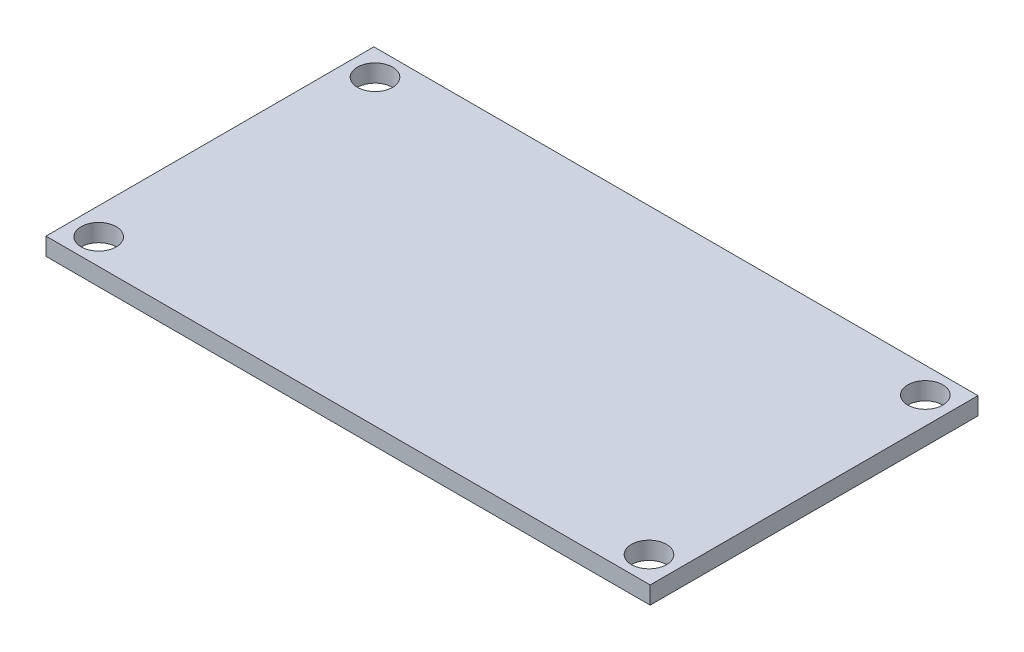
ISO-10303-21;
HEADER;
FILE_DESCRIPTION(('STEP AP214'),'2;1');
FILE_NAME('part.step','',(''),(''),'','','');
FILE_SCHEMA(('AUTOMOTIVE_DESIGN { 1 0 10303 214 1 1 1 1 }'));
ENDSEC;
DATA;
#1=APPLICATION_CONTEXT('core data for automotive mechanical design processes');
#2=APPLICATION_PROTOCOL_DEFINITION('international standard','automotive_design',2000,#1);
#3=PRODUCT_CONTEXT('',#1,'mechanical');
#4=PRODUCT('Part','Part','',(#3));
#5=PRODUCT_RELATED_PRODUCT_CATEGORY('part','',(#4));
#6=PRODUCT_DEFINITION_FORMATION('','',#4);
#7=PRODUCT_DEFINITION_CONTEXT('part definition',#1,'design');
#8=PRODUCT_DEFINITION('design','',#6,#7);
#9=PRODUCT_DEFINITION_SHAPE('','',#8);
#10=(LENGTH_UNIT() NAMED_UNIT(*) SI_UNIT(.MILLI.,.METRE.));
#11=(NAMED_UNIT(*) PLANE_ANGLE_UNIT() SI_UNIT($,.RADIAN.));
#12=(NAMED_UNIT(*) SI_UNIT($,.STERADIAN.) SOLID_ANGLE_UNIT());
#13=UNCERTAINTY_MEASURE_WITH_UNIT(LENGTH_MEASURE(1.E-05),#10,'distance_accuracy_value','');
#14=(GEOMETRIC_REPRESENTATION_CONTEXT(3) GLOBAL_UNCERTAINTY_ASSIGNED_CONTEXT((#13)) GLOBAL_UNIT_ASSIGNED_CONTEXT((#10,
#11,#12)) REPRESENTATION_CONTEXT('',''));
#15=CARTESIAN_POINT('',(0.,0.,0.));
#16=DIRECTION('',(0.,0.,1.));
#17=DIRECTION('',(1.,0.,0.));
#18=AXIS2_PLACEMENT_3D('',#15,#16,#17);
#19=CARTESIAN_POINT('',(0.,1.5,0.));
#20=DIRECTION('',(1.,0.,0.));
#21=DIRECTION('',(0.,0.,-1.));
#22=AXIS2_PLACEMENT_3D('',#19,#20,#21);
#23=PLANE('',#22);
#24=DIRECTION('',(0.,0.,1.));
#25=VECTOR('',#24,1.);
#26=CARTESIAN_POINT('',(0.,0.,0.));
#27=LINE('',#26,#25);
#28=CARTESIAN_POINT('',(0.,0.,0.));
#29=VERTEX_POINT('',#28);
#30=CARTESIAN_POINT('',(0.,0.,28.));
#31=VERTEX_POINT('',#30);
#32=EDGE_CURVE('E96',#29,#31,#27,.T.);
#33=ORIENTED_EDGE('',*,*,#32,.T.);
#34=DIRECTION('',(0.,-1.,0.));
#35=VECTOR('',#34,1.);
#36=CARTESIAN_POINT('',(0.,1.5,28.));
#37=LINE('',#36,#35);
#38=CARTESIAN_POINT('',(0.,1.5,28.));
#39=VERTEX_POINT('',#38);
#40=EDGE_CURVE('E11',#39,#31,#37,.T.);
#41=ORIENTED_EDGE('',*,*,#40,.F.);
#42=DIRECTION('',(0.,0.,1.));
#43=VECTOR('',#42,1.);
#44=CARTESIAN_POINT('',(0.,1.5,0.));
#45=LINE('',#44,#43);
#46=CARTESIAN_POINT('',(0.,1.5,0.));
#47=VERTEX_POINT('',#46);
#48=EDGE_CURVE('E84',#47,#39,#45,.T.);
#49=ORIENTED_EDGE('',*,*,#48,.F.);
#50=DIRECTION('',(0.,-1.,0.));
#51=VECTOR('',#50,1.);
#52=CARTESIAN_POINT('',(0.,1.5,0.));
#53=LINE('',#52,#51);
#54=EDGE_CURVE('E92',#47,#29,#53,.T.);
#55=ORIENTED_EDGE('',*,*,#54,.T.);
#56=EDGE_LOOP('',(#33,#41,#49,#55));
#57=FACE_BOUND('',#56,.T.);
#58=ADVANCED_FACE('F33',(#57),#23,.F.);
#59=CARTESIAN_POINT('',(0.,1.5,28.));
#60=DIRECTION('',(0.,0.,-1.));
#61=DIRECTION('',(-1.,0.,0.));
#62=AXIS2_PLACEMENT_3D('',#59,#60,#61);
#63=PLANE('',#62);
#64=DIRECTION('',(1.,0.,0.));
#65=VECTOR('',#64,1.);
#66=CARTESIAN_POINT('',(0.,0.,28.));
#67=LINE('',#66,#65);
#68=CARTESIAN_POINT('',(51.6,0.,28.));
#69=VERTEX_POINT('',#68);
#70=EDGE_CURVE('E88',#31,#69,#67,.T.);
#71=ORIENTED_EDGE('',*,*,#70,.T.);
#72=DIRECTION('',(0.,-1.,0.));
#73=VECTOR('',#72,1.);
#74=CARTESIAN_POINT('',(51.6,1.5,28.));
#75=LINE('',#74,#73);
#76=CARTESIAN_POINT('',(51.6,1.5,28.));
#77=VERTEX_POINT('',#76);
#78=EDGE_CURVE('E41',#77,#69,#75,.T.);
#79=ORIENTED_EDGE('',*,*,#78,.F.);
#80=DIRECTION('',(1.,0.,0.));
#81=VECTOR('',#80,1.);
#82=CARTESIAN_POINT('',(0.,1.5,28.));
#83=LINE('',#82,#81);
#84=EDGE_CURVE('E79',#39,#77,#83,.T.);
#85=ORIENTED_EDGE('',*,*,#84,.F.);
#86=ORIENTED_EDGE('',*,*,#40,.T.);
#87=EDGE_LOOP('',(#71,#79,#85,#86));
#88=FACE_BOUND('',#87,.T.);
#89=ADVANCED_FACE('F87',(#88),#63,.F.);
#90=CARTESIAN_POINT('',(51.6,1.5,0.));
#91=DIRECTION('',(-1.,0.,0.));
#92=DIRECTION('',(0.,0.,1.));
#93=AXIS2_PLACEMENT_3D('',#90,#91,#92);
#94=PLANE('',#93);
#95=DIRECTION('',(0.,0.,-1.));
#96=VECTOR('',#95,1.);
#97=CARTESIAN_POINT('',(51.6,0.,0.));
#98=LINE('',#97,#96);
#99=CARTESIAN_POINT('',(51.6,0.,0.));
#100=VERTEX_POINT('',#99);
#101=EDGE_CURVE('E66',#69,#100,#98,.T.);
#102=ORIENTED_EDGE('',*,*,#101,.T.);
#103=DIRECTION('',(0.,-1.,0.));
#104=VECTOR('',#103,1.);
#105=CARTESIAN_POINT('',(51.6,1.5,0.));
#106=LINE('',#105,#104);
#107=CARTESIAN_POINT('',(51.6,1.5,0.));
#108=VERTEX_POINT('',#107);
#109=EDGE_CURVE('E89',#108,#100,#106,.T.);
#110=ORIENTED_EDGE('',*,*,#109,.F.);
#111=DIRECTION('',(0.,0.,-1.));
#112=VECTOR('',#111,1.);
#113=CARTESIAN_POINT('',(51.6,1.5,0.));
#114=LINE('',#113,#112);
#115=EDGE_CURVE('E82',#77,#108,#114,.T.);
#116=ORIENTED_EDGE('',*,*,#115,.F.);
#117=ORIENTED_EDGE('',*,*,#78,.T.);
#118=EDGE_LOOP('',(#102,#110,#116,#117));
#119=FACE_BOUND('',#118,.T.);
#120=ADVANCED_FACE('F90',(#119),#94,.F.);
#121=CARTESIAN_POINT('',(0.,1.5,0.));
#122=DIRECTION('',(0.,0.,1.));
#123=DIRECTION('',(1.,0.,0.));
#124=AXIS2_PLACEMENT_3D('',#121,#122,#123);
#125=PLANE('',#124);
#126=DIRECTION('',(-1.,0.,0.));
#127=VECTOR('',#126,1.);
#128=CARTESIAN_POINT('',(0.,0.,0.));
#129=LINE('',#128,#127);
#130=EDGE_CURVE('E72',#100,#29,#129,.T.);
#131=ORIENTED_EDGE('',*,*,#130,.T.);
#132=ORIENTED_EDGE('',*,*,#54,.F.);
#133=DIRECTION('',(-1.,0.,0.));
#134=VECTOR('',#133,1.);
#135=CARTESIAN_POINT('',(0.,1.5,0.));
#136=LINE('',#135,#134);
#137=EDGE_CURVE('E49',#108,#47,#136,.T.);
#138=ORIENTED_EDGE('',*,*,#137,.F.);
#139=ORIENTED_EDGE('',*,*,#109,.T.);
#140=EDGE_LOOP('',(#131,#132,#138,#139));
#141=FACE_BOUND('',#140,.T.);
#142=ADVANCED_FACE('F104',(#141),#125,.F.);
#143=CARTESIAN_POINT('',(0.,1.5,0.));
#144=DIRECTION('',(0.,1.,0.));
#145=DIRECTION('',(0.,0.,1.));
#146=AXIS2_PLACEMENT_3D('',#143,#144,#145);
#147=PLANE('',#146);
#148=CARTESIAN_POINT('',(2.30000000000025,1.5,25.8));
#149=DIRECTION('',(0.,1.,0.));
#150=DIRECTION('',(0.,0.,1.));
#151=AXIS2_PLACEMENT_3D('',#148,#149,#150);
#152=CIRCLE('',#151,1.5);
#153=CARTESIAN_POINT('',(2.30000000000025,1.5,27.3));
#154=VERTEX_POINT('',#153);
#155=EDGE_CURVE('E116',#154,#154,#152,.T.);
#156=ORIENTED_EDGE('',*,*,#155,.F.);
#157=EDGE_LOOP('',(#156));
#158=FACE_BOUND('',#157,.T.);
#159=CARTESIAN_POINT('',(49.3000000000002,1.5,25.8));
#160=DIRECTION('',(0.,1.,0.));
#161=DIRECTION('',(0.,0.,1.));
#162=AXIS2_PLACEMENT_3D('',#159,#160,#161);
#163=CIRCLE('',#162,1.5);
#164=CARTESIAN_POINT('',(49.3000000000002,1.5,27.3));
#165=VERTEX_POINT('',#164);
#166=EDGE_CURVE('E122',#165,#165,#163,.T.);
#167=ORIENTED_EDGE('',*,*,#166,.F.);
#168=EDGE_LOOP('',(#167));
#169=FACE_BOUND('',#168,.T.);
#170=CARTESIAN_POINT('',(49.3,1.5,2.2));
#171=DIRECTION('',(0.,1.,0.));
#172=DIRECTION('',(0.,0.,1.));
#173=AXIS2_PLACEMENT_3D('',#170,#171,#172);
#174=CIRCLE('',#173,1.5);
#175=CARTESIAN_POINT('',(49.3,1.5,3.7));
#176=VERTEX_POINT('',#175);
#177=EDGE_CURVE('E128',#176,#176,#174,.T.);
#178=ORIENTED_EDGE('',*,*,#177,.F.);
#179=EDGE_LOOP('',(#178));
#180=FACE_BOUND('',#179,.T.);
#181=CARTESIAN_POINT('',(2.3,1.5,2.2));
#182=DIRECTION('',(0.,1.,0.));
#183=DIRECTION('',(0.,0.,1.));
#184=AXIS2_PLACEMENT_3D('',#181,#182,#183);
#185=CIRCLE('',#184,1.5);
#186=CARTESIAN_POINT('',(2.3,1.5,3.7));
#187=VERTEX_POINT('',#186);
#188=EDGE_CURVE('E110',#187,#187,#185,.T.);
#189=ORIENTED_EDGE('',*,*,#188,.F.);
#190=EDGE_LOOP('',(#189));
#191=FACE_BOUND('',#190,.T.);
#192=ORIENTED_EDGE('',*,*,#48,.T.);
#193=ORIENTED_EDGE('',*,*,#84,.T.);
#194=ORIENTED_EDGE('',*,*,#115,.T.);
#195=ORIENTED_EDGE('',*,*,#137,.T.);
#196=EDGE_LOOP('',(#192,#193,#194,#195));
#197=FACE_BOUND('',#196,.T.);
#198=ADVANCED_FACE('F80',(#158,#169,#180,#191,#197),#147,.T.);
#199=CARTESIAN_POINT('',(0.,0.,0.));
#200=DIRECTION('',(0.,1.,0.));
#201=DIRECTION('',(0.,0.,1.));
#202=AXIS2_PLACEMENT_3D('',#199,#200,#201);
#203=PLANE('',#202);
#204=CARTESIAN_POINT('',(2.30000000000025,0.,25.8));
#205=DIRECTION('',(0.,1.,0.));
#206=DIRECTION('',(0.,0.,1.));
#207=AXIS2_PLACEMENT_3D('',#204,#205,#206);
#208=CIRCLE('',#207,1.5);
#209=CARTESIAN_POINT('',(2.30000000000025,0.,27.3));
#210=VERTEX_POINT('',#209);
#211=EDGE_CURVE('E119',#210,#210,#208,.T.);
#212=ORIENTED_EDGE('',*,*,#211,.T.);
#213=EDGE_LOOP('',(#212));
#214=FACE_BOUND('',#213,.T.);
#215=CARTESIAN_POINT('',(49.3000000000002,0.,25.8));
#216=DIRECTION('',(0.,1.,0.));
#217=DIRECTION('',(0.,0.,1.));
#218=AXIS2_PLACEMENT_3D('',#215,#216,#217);
#219=CIRCLE('',#218,1.5);
#220=CARTESIAN_POINT('',(49.3000000000002,0.,27.3));
#221=VERTEX_POINT('',#220);
#222=EDGE_CURVE('E125',#221,#221,#219,.T.);
#223=ORIENTED_EDGE('',*,*,#222,.T.);
#224=EDGE_LOOP('',(#223));
#225=FACE_BOUND('',#224,.T.);
#226=CARTESIAN_POINT('',(49.3,0.,2.2));
#227=DIRECTION('',(0.,1.,0.));
#228=DIRECTION('',(0.,0.,1.));
#229=AXIS2_PLACEMENT_3D('',#226,#227,#228);
#230=CIRCLE('',#229,1.5);
#231=CARTESIAN_POINT('',(49.3,0.,3.7));
#232=VERTEX_POINT('',#231);
#233=EDGE_CURVE('E113',#232,#232,#230,.T.);
#234=ORIENTED_EDGE('',*,*,#233,.T.);
#235=EDGE_LOOP('',(#234));
#236=FACE_BOUND('',#235,.T.);
#237=CARTESIAN_POINT('',(2.3,0.,2.2));
#238=DIRECTION('',(0.,1.,0.));
#239=DIRECTION('',(0.,0.,1.));
#240=AXIS2_PLACEMENT_3D('',#237,#238,#239);
#241=CIRCLE('',#240,1.5);
#242=CARTESIAN_POINT('',(2.3,0.,3.7));
#243=VERTEX_POINT('',#242);
#244=EDGE_CURVE('E99',#243,#243,#241,.T.);
#245=ORIENTED_EDGE('',*,*,#244,.T.);
#246=EDGE_LOOP('',(#245));
#247=FACE_BOUND('',#246,.T.);
#248=ORIENTED_EDGE('',*,*,#32,.F.);
#249=ORIENTED_EDGE('',*,*,#130,.F.);
#250=ORIENTED_EDGE('',*,*,#101,.F.);
#251=ORIENTED_EDGE('',*,*,#70,.F.);
#252=EDGE_LOOP('',(#248,#249,#250,#251));
#253=FACE_BOUND('',#252,.T.);
#254=ADVANCED_FACE('F107',(#214,#225,#236,#247,#253),#203,.F.);
#255=CARTESIAN_POINT('',(2.3,0.,2.2));
#256=DIRECTION('',(0.,1.,0.));
#257=DIRECTION('',(0.,0.,1.));
#258=AXIS2_PLACEMENT_3D('',#255,#256,#257);
#259=CYLINDRICAL_SURFACE('',#258,1.5);
#260=ORIENTED_EDGE('',*,*,#244,.F.);
#261=EDGE_LOOP('',(#260));
#262=FACE_BOUND('',#261,.T.);
#263=ORIENTED_EDGE('',*,*,#188,.T.);
#264=EDGE_LOOP('',(#263));
#265=FACE_BOUND('',#264,.T.);
#266=ADVANCED_FACE('F140',(#262,#265),#259,.F.);
#267=CARTESIAN_POINT('',(49.3,0.,2.2));
#268=DIRECTION('',(0.,1.,0.));
#269=DIRECTION('',(0.,0.,1.));
#270=AXIS2_PLACEMENT_3D('',#267,#268,#269);
#271=CYLINDRICAL_SURFACE('',#270,1.5);
#272=ORIENTED_EDGE('',*,*,#233,.F.);
#273=EDGE_LOOP('',(#272));
#274=FACE_BOUND('',#273,.T.);
#275=ORIENTED_EDGE('',*,*,#177,.T.);
#276=EDGE_LOOP('',(#275));
#277=FACE_BOUND('',#276,.T.);
#278=ADVANCED_FACE('F136',(#274,#277),#271,.F.);
#279=CARTESIAN_POINT('',(49.3000000000002,0.,25.8));
#280=DIRECTION('',(0.,1.,0.));
#281=DIRECTION('',(0.,0.,1.));
#282=AXIS2_PLACEMENT_3D('',#279,#280,#281);
#283=CYLINDRICAL_SURFACE('',#282,1.5);
#284=ORIENTED_EDGE('',*,*,#222,.F.);
#285=EDGE_LOOP('',(#284));
#286=FACE_BOUND('',#285,.T.);
#287=ORIENTED_EDGE('',*,*,#166,.T.);
#288=EDGE_LOOP('',(#287));
#289=FACE_BOUND('',#288,.T.);
#290=ADVANCED_FACE('F139',(#286,#289),#283,.F.);
#291=CARTESIAN_POINT('',(2.30000000000025,0.,25.8));
#292=DIRECTION('',(0.,1.,0.));
#293=DIRECTION('',(0.,0.,1.));
#294=AXIS2_PLACEMENT_3D('',#291,#292,#293);
#295=CYLINDRICAL_SURFACE('',#294,1.5);
#296=ORIENTED_EDGE('',*,*,#211,.F.);
#297=EDGE_LOOP('',(#296));
#298=FACE_BOUND('',#297,.T.);
#299=ORIENTED_EDGE('',*,*,#155,.T.);
#300=EDGE_LOOP('',(#299));
#301=FACE_BOUND('',#300,.T.);
#302=ADVANCED_FACE('F201',(#298,#301),#295,.F.);
#303=CLOSED_SHELL('',(#58,#89,#120,#142,#198,#254,#266,#278,#290,#302));
#304=MANIFOLD_SOLID_BREP('B2',#303);
#305=ADVANCED_BREP_SHAPE_REPRESENTATION('',(#18,#304),#14);
#306=SHAPE_DEFINITION_REPRESENTATION(#9,#305);
ENDSEC;
END-ISO-10303-21;
